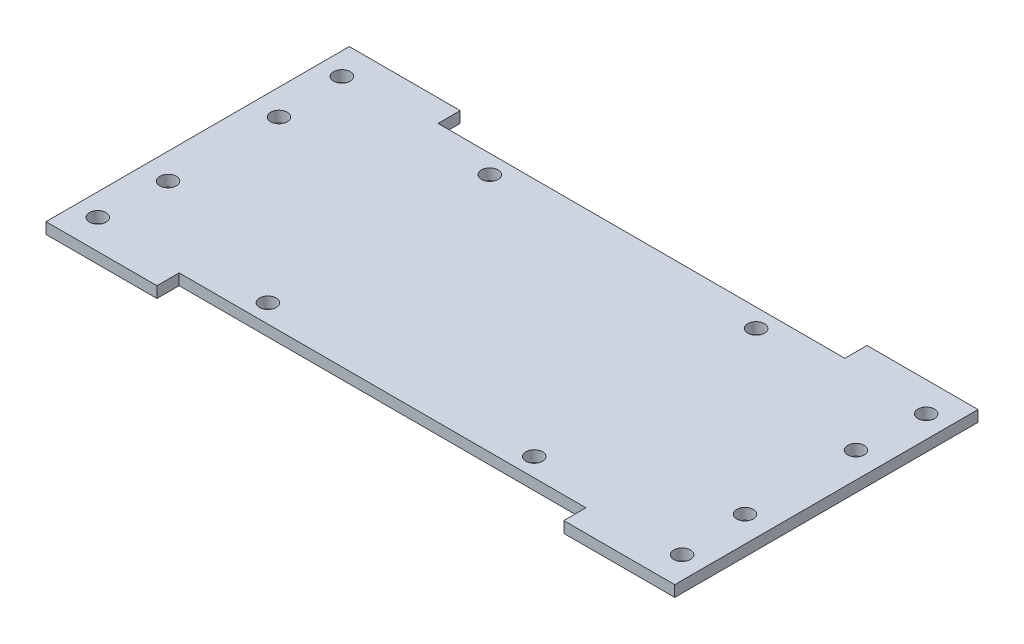
ISO-10303-21;
HEADER;
FILE_DESCRIPTION(('STEP AP214'),'2;1');
FILE_NAME('part.step','',(''),(''),'','','');
FILE_SCHEMA(('AUTOMOTIVE_DESIGN { 1 0 10303 214 1 1 1 1 }'));
ENDSEC;
DATA;
#1=APPLICATION_CONTEXT('core data for automotive mechanical design processes');
#2=APPLICATION_PROTOCOL_DEFINITION('international standard','automotive_design',2000,#1);
#3=PRODUCT_CONTEXT('',#1,'mechanical');
#4=PRODUCT('Part','Part','',(#3));
#5=PRODUCT_RELATED_PRODUCT_CATEGORY('part','',(#4));
#6=PRODUCT_DEFINITION_FORMATION('','',#4);
#7=PRODUCT_DEFINITION_CONTEXT('part definition',#1,'design');
#8=PRODUCT_DEFINITION('design','',#6,#7);
#9=PRODUCT_DEFINITION_SHAPE('','',#8);
#10=(LENGTH_UNIT() NAMED_UNIT(*) SI_UNIT(.MILLI.,.METRE.));
#11=(NAMED_UNIT(*) PLANE_ANGLE_UNIT() SI_UNIT($,.RADIAN.));
#12=(NAMED_UNIT(*) SI_UNIT($,.STERADIAN.) SOLID_ANGLE_UNIT());
#13=UNCERTAINTY_MEASURE_WITH_UNIT(LENGTH_MEASURE(1.E-05),#10,'distance_accuracy_value','');
#14=(GEOMETRIC_REPRESENTATION_CONTEXT(3) GLOBAL_UNCERTAINTY_ASSIGNED_CONTEXT((#13)) GLOBAL_UNIT_ASSIGNED_CONTEXT((#10,
#11,#12)) REPRESENTATION_CONTEXT('',''));
#15=CARTESIAN_POINT('',(0.,0.,0.));
#16=DIRECTION('',(0.,0.,1.));
#17=DIRECTION('',(1.,0.,0.));
#18=AXIS2_PLACEMENT_3D('',#15,#16,#17);
#19=CARTESIAN_POINT('',(0.,1.5,17.5));
#20=DIRECTION('',(0.,0.,1.));
#21=DIRECTION('',(1.,0.,0.));
#22=AXIS2_PLACEMENT_3D('',#19,#20,#21);
#23=PLANE('',#22);
#24=DIRECTION('',(-1.,0.,0.));
#25=VECTOR('',#24,1.);
#26=CARTESIAN_POINT('',(0.,0.,17.5));
#27=LINE('',#26,#25);
#28=CARTESIAN_POINT('',(27.5,0.,17.5));
#29=VERTEX_POINT('',#28);
#30=CARTESIAN_POINT('',(-27.5,0.,17.5));
#31=VERTEX_POINT('',#30);
#32=EDGE_CURVE('E75',#29,#31,#27,.T.);
#33=ORIENTED_EDGE('',*,*,#32,.F.);
#34=DIRECTION('',(0.,-1.,0.));
#35=VECTOR('',#34,1.);
#36=CARTESIAN_POINT('',(27.5,1.5,17.5));
#37=LINE('',#36,#35);
#38=CARTESIAN_POINT('',(27.5,1.5,17.5));
#39=VERTEX_POINT('',#38);
#40=EDGE_CURVE('E50',#39,#29,#37,.T.);
#41=ORIENTED_EDGE('',*,*,#40,.F.);
#42=DIRECTION('',(-1.,0.,0.));
#43=VECTOR('',#42,1.);
#44=CARTESIAN_POINT('',(0.,1.5,17.5));
#45=LINE('',#44,#43);
#46=CARTESIAN_POINT('',(-27.5,1.5,17.5));
#47=VERTEX_POINT('',#46);
#48=EDGE_CURVE('E83',#39,#47,#45,.T.);
#49=ORIENTED_EDGE('',*,*,#48,.T.);
#50=DIRECTION('',(0.,-1.,0.));
#51=VECTOR('',#50,1.);
#52=CARTESIAN_POINT('',(-27.5,1.5,17.5));
#53=LINE('',#52,#51);
#54=EDGE_CURVE('E11',#47,#31,#53,.T.);
#55=ORIENTED_EDGE('',*,*,#54,.T.);
#56=EDGE_LOOP('',(#33,#41,#49,#55));
#57=FACE_BOUND('',#56,.T.);
#58=ADVANCED_FACE('F41',(#57),#23,.T.);
#59=CARTESIAN_POINT('',(0.,1.5,-17.5));
#60=DIRECTION('',(0.,0.,1.));
#61=DIRECTION('',(1.,0.,0.));
#62=AXIS2_PLACEMENT_3D('',#59,#60,#61);
#63=PLANE('',#62);
#64=DIRECTION('',(-1.,0.,0.));
#65=VECTOR('',#64,1.);
#66=CARTESIAN_POINT('',(0.,0.,-17.5));
#67=LINE('',#66,#65);
#68=CARTESIAN_POINT('',(27.5,0.,-17.5));
#69=VERTEX_POINT('',#68);
#70=CARTESIAN_POINT('',(-27.5,0.,-17.5));
#71=VERTEX_POINT('',#70);
#72=EDGE_CURVE('E101',#69,#71,#67,.T.);
#73=ORIENTED_EDGE('',*,*,#72,.T.);
#74=DIRECTION('',(0.,-1.,0.));
#75=VECTOR('',#74,1.);
#76=CARTESIAN_POINT('',(-27.5,1.5,-17.5));
#77=LINE('',#76,#75);
#78=CARTESIAN_POINT('',(-27.5,1.5,-17.5));
#79=VERTEX_POINT('',#78);
#80=EDGE_CURVE('E146',#79,#71,#77,.T.);
#81=ORIENTED_EDGE('',*,*,#80,.F.);
#82=DIRECTION('',(-1.,0.,0.));
#83=VECTOR('',#82,1.);
#84=CARTESIAN_POINT('',(0.,1.5,-17.5));
#85=LINE('',#84,#83);
#86=CARTESIAN_POINT('',(27.5,1.5,-17.5));
#87=VERTEX_POINT('',#86);
#88=EDGE_CURVE('E58',#87,#79,#85,.T.);
#89=ORIENTED_EDGE('',*,*,#88,.F.);
#90=DIRECTION('',(0.,-1.,0.));
#91=VECTOR('',#90,1.);
#92=CARTESIAN_POINT('',(27.5,1.5,-17.5));
#93=LINE('',#92,#91);
#94=EDGE_CURVE('E89',#87,#69,#93,.T.);
#95=ORIENTED_EDGE('',*,*,#94,.T.);
#96=EDGE_LOOP('',(#73,#81,#89,#95));
#97=FACE_BOUND('',#96,.T.);
#98=ADVANCED_FACE('F159',(#97),#63,.F.);
#99=CARTESIAN_POINT('',(0.,1.5,0.));
#100=DIRECTION('',(0.,1.,0.));
#101=DIRECTION('',(0.,0.,1.));
#102=AXIS2_PLACEMENT_3D('',#99,#100,#101);
#103=PLANE('',#102);
#104=CARTESIAN_POINT('',(39.,1.5,7.5));
#105=DIRECTION('',(0.,1.,0.));
#106=DIRECTION('',(0.,0.,1.));
#107=AXIS2_PLACEMENT_3D('',#104,#105,#106);
#108=CIRCLE('',#107,1.125);
#109=CARTESIAN_POINT('',(39.,1.5,8.625));
#110=VERTEX_POINT('',#109);
#111=EDGE_CURVE('E310',#110,#110,#108,.T.);
#112=ORIENTED_EDGE('',*,*,#111,.F.);
#113=EDGE_LOOP('',(#112));
#114=FACE_BOUND('',#113,.T.);
#115=CARTESIAN_POINT('',(39.,1.5,-7.5));
#116=DIRECTION('',(0.,1.,0.));
#117=DIRECTION('',(0.,0.,1.));
#118=AXIS2_PLACEMENT_3D('',#115,#116,#117);
#119=CIRCLE('',#118,1.125);
#120=CARTESIAN_POINT('',(39.,1.5,-6.375));
#121=VERTEX_POINT('',#120);
#122=EDGE_CURVE('E314',#121,#121,#119,.T.);
#123=ORIENTED_EDGE('',*,*,#122,.F.);
#124=EDGE_LOOP('',(#123));
#125=FACE_BOUND('',#124,.T.);
#126=CARTESIAN_POINT('',(39.5,1.5,-16.5));
#127=DIRECTION('',(0.,1.,0.));
#128=DIRECTION('',(0.,0.,1.));
#129=AXIS2_PLACEMENT_3D('',#126,#127,#128);
#130=CIRCLE('',#129,1.125);
#131=CARTESIAN_POINT('',(39.5,1.5,-15.375));
#132=VERTEX_POINT('',#131);
#133=EDGE_CURVE('E318',#132,#132,#130,.T.);
#134=ORIENTED_EDGE('',*,*,#133,.F.);
#135=EDGE_LOOP('',(#134));
#136=FACE_BOUND('',#135,.T.);
#137=CARTESIAN_POINT('',(39.5,1.5,16.5));
#138=DIRECTION('',(0.,1.,0.));
#139=DIRECTION('',(0.,0.,1.));
#140=AXIS2_PLACEMENT_3D('',#137,#138,#139);
#141=CIRCLE('',#140,1.125);
#142=CARTESIAN_POINT('',(39.5,1.5,17.625));
#143=VERTEX_POINT('',#142);
#144=EDGE_CURVE('E322',#143,#143,#141,.T.);
#145=ORIENTED_EDGE('',*,*,#144,.F.);
#146=EDGE_LOOP('',(#145));
#147=FACE_BOUND('',#146,.T.);
#148=CARTESIAN_POINT('',(-39.,1.5,7.5));
#149=DIRECTION('',(0.,1.,0.));
#150=DIRECTION('',(0.,0.,1.));
#151=AXIS2_PLACEMENT_3D('',#148,#149,#150);
#152=CIRCLE('',#151,1.125);
#153=CARTESIAN_POINT('',(-39.,1.5,8.625));
#154=VERTEX_POINT('',#153);
#155=EDGE_CURVE('E247',#154,#154,#152,.F.);
#156=ORIENTED_EDGE('',*,*,#155,.T.);
#157=EDGE_LOOP('',(#156));
#158=FACE_BOUND('',#157,.T.);
#159=CARTESIAN_POINT('',(-39.,1.5,-7.5));
#160=DIRECTION('',(0.,1.,0.));
#161=DIRECTION('',(0.,0.,1.));
#162=AXIS2_PLACEMENT_3D('',#159,#160,#161);
#163=CIRCLE('',#162,1.125);
#164=CARTESIAN_POINT('',(-39.,1.5,-6.375));
#165=VERTEX_POINT('',#164);
#166=EDGE_CURVE('E250',#165,#165,#163,.F.);
#167=ORIENTED_EDGE('',*,*,#166,.T.);
#168=EDGE_LOOP('',(#167));
#169=FACE_BOUND('',#168,.T.);
#170=CARTESIAN_POINT('',(-39.5,1.5,-16.5));
#171=DIRECTION('',(0.,1.,0.));
#172=DIRECTION('',(0.,0.,1.));
#173=AXIS2_PLACEMENT_3D('',#170,#171,#172);
#174=CIRCLE('',#173,1.125);
#175=CARTESIAN_POINT('',(-39.5,1.5,-15.375));
#176=VERTEX_POINT('',#175);
#177=EDGE_CURVE('E254',#176,#176,#174,.F.);
#178=ORIENTED_EDGE('',*,*,#177,.T.);
#179=EDGE_LOOP('',(#178));
#180=FACE_BOUND('',#179,.T.);
#181=CARTESIAN_POINT('',(-18.,1.5,-15.));
#182=DIRECTION('',(0.,1.,0.));
#183=DIRECTION('',(0.,0.,1.));
#184=AXIS2_PLACEMENT_3D('',#181,#182,#183);
#185=CIRCLE('',#184,1.125);
#186=CARTESIAN_POINT('',(-18.,1.5,-13.875));
#187=VERTEX_POINT('',#186);
#188=EDGE_CURVE('E258',#187,#187,#185,.F.);
#189=ORIENTED_EDGE('',*,*,#188,.T.);
#190=EDGE_LOOP('',(#189));
#191=FACE_BOUND('',#190,.T.);
#192=CARTESIAN_POINT('',(18.,1.5,15.));
#193=DIRECTION('',(0.,1.,0.));
#194=DIRECTION('',(0.,0.,1.));
#195=AXIS2_PLACEMENT_3D('',#192,#193,#194);
#196=CIRCLE('',#195,1.125);
#197=CARTESIAN_POINT('',(18.,1.5,16.125));
#198=VERTEX_POINT('',#197);
#199=EDGE_CURVE('E262',#198,#198,#196,.F.);
#200=ORIENTED_EDGE('',*,*,#199,.T.);
#201=EDGE_LOOP('',(#200));
#202=FACE_BOUND('',#201,.T.);
#203=CARTESIAN_POINT('',(-18.,1.5,15.));
#204=DIRECTION('',(0.,1.,0.));
#205=DIRECTION('',(0.,0.,1.));
#206=AXIS2_PLACEMENT_3D('',#203,#204,#205);
#207=CIRCLE('',#206,1.125);
#208=CARTESIAN_POINT('',(-18.,1.5,16.125));
#209=VERTEX_POINT('',#208);
#210=EDGE_CURVE('E266',#209,#209,#207,.F.);
#211=ORIENTED_EDGE('',*,*,#210,.T.);
#212=EDGE_LOOP('',(#211));
#213=FACE_BOUND('',#212,.T.);
#214=CARTESIAN_POINT('',(18.,1.5,-15.));
#215=DIRECTION('',(0.,1.,0.));
#216=DIRECTION('',(0.,0.,1.));
#217=AXIS2_PLACEMENT_3D('',#214,#215,#216);
#218=CIRCLE('',#217,1.125);
#219=CARTESIAN_POINT('',(18.,1.5,-13.875));
#220=VERTEX_POINT('',#219);
#221=EDGE_CURVE('E270',#220,#220,#218,.F.);
#222=ORIENTED_EDGE('',*,*,#221,.T.);
#223=EDGE_LOOP('',(#222));
#224=FACE_BOUND('',#223,.T.);
#225=CARTESIAN_POINT('',(-39.5,1.5,16.5));
#226=DIRECTION('',(0.,1.,0.));
#227=DIRECTION('',(0.,0.,1.));
#228=AXIS2_PLACEMENT_3D('',#225,#226,#227);
#229=CIRCLE('',#228,1.125);
#230=CARTESIAN_POINT('',(-39.5,1.5,17.625));
#231=VERTEX_POINT('',#230);
#232=EDGE_CURVE('E274',#231,#231,#229,.F.);
#233=ORIENTED_EDGE('',*,*,#232,.T.);
#234=EDGE_LOOP('',(#233));
#235=FACE_BOUND('',#234,.T.);
#236=ORIENTED_EDGE('',*,*,#88,.T.);
#237=DIRECTION('',(0.,0.,-1.));
#238=VECTOR('',#237,1.);
#239=CARTESIAN_POINT('',(-27.5,1.5,20.5));
#240=LINE('',#239,#238);
#241=CARTESIAN_POINT('',(-27.5,1.5,-20.5));
#242=VERTEX_POINT('',#241);
#243=EDGE_CURVE('E201',#79,#242,#240,.T.);
#244=ORIENTED_EDGE('',*,*,#243,.T.);
#245=DIRECTION('',(-1.,0.,0.));
#246=VECTOR('',#245,1.);
#247=CARTESIAN_POINT('',(-42.5,1.5,-20.5));
#248=LINE('',#247,#246);
#249=CARTESIAN_POINT('',(-42.5,1.5,-20.5));
#250=VERTEX_POINT('',#249);
#251=EDGE_CURVE('E210',#242,#250,#248,.T.);
#252=ORIENTED_EDGE('',*,*,#251,.T.);
#253=DIRECTION('',(0.,0.,1.));
#254=VECTOR('',#253,1.);
#255=CARTESIAN_POINT('',(-42.5,1.5,20.5));
#256=LINE('',#255,#254);
#257=CARTESIAN_POINT('',(-42.5,1.5,20.5));
#258=VERTEX_POINT('',#257);
#259=EDGE_CURVE('E206',#250,#258,#256,.T.);
#260=ORIENTED_EDGE('',*,*,#259,.T.);
#261=DIRECTION('',(1.,0.,0.));
#262=VECTOR('',#261,1.);
#263=CARTESIAN_POINT('',(-42.5,1.5,20.5));
#264=LINE('',#263,#262);
#265=CARTESIAN_POINT('',(-27.5,1.5,20.5));
#266=VERTEX_POINT('',#265);
#267=EDGE_CURVE('E204',#258,#266,#264,.T.);
#268=ORIENTED_EDGE('',*,*,#267,.T.);
#269=EDGE_CURVE('E99',#266,#47,#240,.T.);
#270=ORIENTED_EDGE('',*,*,#269,.T.);
#271=ORIENTED_EDGE('',*,*,#48,.F.);
#272=DIRECTION('',(0.,0.,1.));
#273=VECTOR('',#272,1.);
#274=CARTESIAN_POINT('',(27.5,1.5,20.5));
#275=LINE('',#274,#273);
#276=CARTESIAN_POINT('',(27.5,1.5,20.5));
#277=VERTEX_POINT('',#276);
#278=EDGE_CURVE('E95',#39,#277,#275,.T.);
#279=ORIENTED_EDGE('',*,*,#278,.T.);
#280=DIRECTION('',(1.,0.,0.));
#281=VECTOR('',#280,1.);
#282=CARTESIAN_POINT('',(42.5,1.5,20.5));
#283=LINE('',#282,#281);
#284=CARTESIAN_POINT('',(42.5,1.5,20.5));
#285=VERTEX_POINT('',#284);
#286=EDGE_CURVE('E123',#277,#285,#283,.T.);
#287=ORIENTED_EDGE('',*,*,#286,.T.);
#288=DIRECTION('',(0.,0.,-1.));
#289=VECTOR('',#288,1.);
#290=CARTESIAN_POINT('',(42.5,1.5,20.5));
#291=LINE('',#290,#289);
#292=CARTESIAN_POINT('',(42.5,1.5,-20.5));
#293=VERTEX_POINT('',#292);
#294=EDGE_CURVE('E114',#285,#293,#291,.T.);
#295=ORIENTED_EDGE('',*,*,#294,.T.);
#296=DIRECTION('',(-1.,0.,0.));
#297=VECTOR('',#296,1.);
#298=CARTESIAN_POINT('',(42.5,1.5,-20.5));
#299=LINE('',#298,#297);
#300=CARTESIAN_POINT('',(27.5,1.5,-20.5));
#301=VERTEX_POINT('',#300);
#302=EDGE_CURVE('E109',#293,#301,#299,.T.);
#303=ORIENTED_EDGE('',*,*,#302,.T.);
#304=EDGE_CURVE('E108',#301,#87,#275,.T.);
#305=ORIENTED_EDGE('',*,*,#304,.T.);
#306=EDGE_LOOP('',(#236,#244,#252,#260,#268,#270,#271,#279,#287,#295,#303,#305));
#307=FACE_BOUND('',#306,.T.);
#308=ADVANCED_FACE('F92',(#114,#125,#136,#147,#158,#169,#180,#191,#202,#213,#224,#235,#307),
#103,.T.);
#309=CARTESIAN_POINT('',(0.,0.,0.));
#310=DIRECTION('',(0.,1.,0.));
#311=DIRECTION('',(0.,0.,1.));
#312=AXIS2_PLACEMENT_3D('',#309,#310,#311);
#313=PLANE('',#312);
#314=CARTESIAN_POINT('',(39.,0.,7.5));
#315=DIRECTION('',(0.,-1.,0.));
#316=DIRECTION('',(0.,0.,1.));
#317=AXIS2_PLACEMENT_3D('',#314,#315,#316);
#318=CIRCLE('',#317,1.125);
#319=CARTESIAN_POINT('',(39.,0.,8.625));
#320=VERTEX_POINT('',#319);
#321=EDGE_CURVE('E330',#320,#320,#318,.T.);
#322=ORIENTED_EDGE('',*,*,#321,.F.);
#323=EDGE_LOOP('',(#322));
#324=FACE_BOUND('',#323,.T.);
#325=CARTESIAN_POINT('',(39.,0.,-7.5));
#326=DIRECTION('',(0.,-1.,0.));
#327=DIRECTION('',(0.,0.,1.));
#328=AXIS2_PLACEMENT_3D('',#325,#326,#327);
#329=CIRCLE('',#328,1.125);
#330=CARTESIAN_POINT('',(39.,0.,-6.375));
#331=VERTEX_POINT('',#330);
#332=EDGE_CURVE('E334',#331,#331,#329,.T.);
#333=ORIENTED_EDGE('',*,*,#332,.F.);
#334=EDGE_LOOP('',(#333));
#335=FACE_BOUND('',#334,.T.);
#336=CARTESIAN_POINT('',(39.5,0.,-16.5));
#337=DIRECTION('',(0.,-1.,0.));
#338=DIRECTION('',(0.,0.,1.));
#339=AXIS2_PLACEMENT_3D('',#336,#337,#338);
#340=CIRCLE('',#339,1.125);
#341=CARTESIAN_POINT('',(39.5,0.,-15.375));
#342=VERTEX_POINT('',#341);
#343=EDGE_CURVE('E338',#342,#342,#340,.T.);
#344=ORIENTED_EDGE('',*,*,#343,.F.);
#345=EDGE_LOOP('',(#344));
#346=FACE_BOUND('',#345,.T.);
#347=CARTESIAN_POINT('',(39.5,0.,16.5));
#348=DIRECTION('',(0.,-1.,0.));
#349=DIRECTION('',(0.,0.,1.));
#350=AXIS2_PLACEMENT_3D('',#347,#348,#349);
#351=CIRCLE('',#350,1.125);
#352=CARTESIAN_POINT('',(39.5,0.,17.625));
#353=VERTEX_POINT('',#352);
#354=EDGE_CURVE('E326',#353,#353,#351,.T.);
#355=ORIENTED_EDGE('',*,*,#354,.F.);
#356=EDGE_LOOP('',(#355));
#357=FACE_BOUND('',#356,.T.);
#358=CARTESIAN_POINT('',(-39.,0.,7.5));
#359=DIRECTION('',(0.,1.,0.));
#360=DIRECTION('',(0.,0.,1.));
#361=AXIS2_PLACEMENT_3D('',#358,#359,#360);
#362=CIRCLE('',#361,1.125);
#363=CARTESIAN_POINT('',(-39.,0.,8.625));
#364=VERTEX_POINT('',#363);
#365=EDGE_CURVE('E282',#364,#364,#362,.T.);
#366=ORIENTED_EDGE('',*,*,#365,.T.);
#367=EDGE_LOOP('',(#366));
#368=FACE_BOUND('',#367,.T.);
#369=CARTESIAN_POINT('',(-39.,0.,-7.5));
#370=DIRECTION('',(0.,1.,0.));
#371=DIRECTION('',(0.,0.,1.));
#372=AXIS2_PLACEMENT_3D('',#369,#370,#371);
#373=CIRCLE('',#372,1.125);
#374=CARTESIAN_POINT('',(-39.,0.,-6.375));
#375=VERTEX_POINT('',#374);
#376=EDGE_CURVE('E286',#375,#375,#373,.T.);
#377=ORIENTED_EDGE('',*,*,#376,.T.);
#378=EDGE_LOOP('',(#377));
#379=FACE_BOUND('',#378,.T.);
#380=CARTESIAN_POINT('',(-39.5,0.,-16.5));
#381=DIRECTION('',(0.,1.,0.));
#382=DIRECTION('',(0.,0.,1.));
#383=AXIS2_PLACEMENT_3D('',#380,#381,#382);
#384=CIRCLE('',#383,1.125);
#385=CARTESIAN_POINT('',(-39.5,0.,-15.375));
#386=VERTEX_POINT('',#385);
#387=EDGE_CURVE('E290',#386,#386,#384,.T.);
#388=ORIENTED_EDGE('',*,*,#387,.T.);
#389=EDGE_LOOP('',(#388));
#390=FACE_BOUND('',#389,.T.);
#391=CARTESIAN_POINT('',(-18.,0.,-15.));
#392=DIRECTION('',(0.,1.,0.));
#393=DIRECTION('',(0.,0.,1.));
#394=AXIS2_PLACEMENT_3D('',#391,#392,#393);
#395=CIRCLE('',#394,1.125);
#396=CARTESIAN_POINT('',(-18.,0.,-13.875));
#397=VERTEX_POINT('',#396);
#398=EDGE_CURVE('E294',#397,#397,#395,.T.);
#399=ORIENTED_EDGE('',*,*,#398,.T.);
#400=EDGE_LOOP('',(#399));
#401=FACE_BOUND('',#400,.T.);
#402=CARTESIAN_POINT('',(18.,0.,15.));
#403=DIRECTION('',(0.,1.,0.));
#404=DIRECTION('',(0.,0.,1.));
#405=AXIS2_PLACEMENT_3D('',#402,#403,#404);
#406=CIRCLE('',#405,1.125);
#407=CARTESIAN_POINT('',(18.,0.,16.125));
#408=VERTEX_POINT('',#407);
#409=EDGE_CURVE('E306',#408,#408,#406,.T.);
#410=ORIENTED_EDGE('',*,*,#409,.T.);
#411=EDGE_LOOP('',(#410));
#412=FACE_BOUND('',#411,.T.);
#413=CARTESIAN_POINT('',(-18.,0.,15.));
#414=DIRECTION('',(0.,1.,0.));
#415=DIRECTION('',(0.,0.,1.));
#416=AXIS2_PLACEMENT_3D('',#413,#414,#415);
#417=CIRCLE('',#416,1.125);
#418=CARTESIAN_POINT('',(-18.,0.,16.125));
#419=VERTEX_POINT('',#418);
#420=EDGE_CURVE('E302',#419,#419,#417,.T.);
#421=ORIENTED_EDGE('',*,*,#420,.T.);
#422=EDGE_LOOP('',(#421));
#423=FACE_BOUND('',#422,.T.);
#424=CARTESIAN_POINT('',(18.,0.,-15.));
#425=DIRECTION('',(0.,1.,0.));
#426=DIRECTION('',(0.,0.,1.));
#427=AXIS2_PLACEMENT_3D('',#424,#425,#426);
#428=CIRCLE('',#427,1.125);
#429=CARTESIAN_POINT('',(18.,0.,-13.875));
#430=VERTEX_POINT('',#429);
#431=EDGE_CURVE('E298',#430,#430,#428,.T.);
#432=ORIENTED_EDGE('',*,*,#431,.T.);
#433=EDGE_LOOP('',(#432));
#434=FACE_BOUND('',#433,.T.);
#435=CARTESIAN_POINT('',(-39.5,0.,16.5));
#436=DIRECTION('',(0.,1.,0.));
#437=DIRECTION('',(0.,0.,1.));
#438=AXIS2_PLACEMENT_3D('',#435,#436,#437);
#439=CIRCLE('',#438,1.125);
#440=CARTESIAN_POINT('',(-39.5,0.,17.625));
#441=VERTEX_POINT('',#440);
#442=EDGE_CURVE('E278',#441,#441,#439,.T.);
#443=ORIENTED_EDGE('',*,*,#442,.T.);
#444=EDGE_LOOP('',(#443));
#445=FACE_BOUND('',#444,.T.);
#446=ORIENTED_EDGE('',*,*,#32,.T.);
#447=DIRECTION('',(0.,0.,-1.));
#448=VECTOR('',#447,1.);
#449=CARTESIAN_POINT('',(-27.5,0.,20.5));
#450=LINE('',#449,#448);
#451=CARTESIAN_POINT('',(-27.5,0.,20.5));
#452=VERTEX_POINT('',#451);
#453=EDGE_CURVE('E222',#452,#31,#450,.T.);
#454=ORIENTED_EDGE('',*,*,#453,.F.);
#455=DIRECTION('',(1.,0.,0.));
#456=VECTOR('',#455,1.);
#457=CARTESIAN_POINT('',(-42.5,0.,20.5));
#458=LINE('',#457,#456);
#459=CARTESIAN_POINT('',(-42.5,0.,20.5));
#460=VERTEX_POINT('',#459);
#461=EDGE_CURVE('E231',#460,#452,#458,.T.);
#462=ORIENTED_EDGE('',*,*,#461,.F.);
#463=DIRECTION('',(0.,0.,1.));
#464=VECTOR('',#463,1.);
#465=CARTESIAN_POINT('',(-42.5,0.,20.5));
#466=LINE('',#465,#464);
#467=CARTESIAN_POINT('',(-42.5,0.,-20.5));
#468=VERTEX_POINT('',#467);
#469=EDGE_CURVE('E239',#468,#460,#466,.T.);
#470=ORIENTED_EDGE('',*,*,#469,.F.);
#471=DIRECTION('',(-1.,0.,0.));
#472=VECTOR('',#471,1.);
#473=CARTESIAN_POINT('',(-42.5,0.,-20.5));
#474=LINE('',#473,#472);
#475=CARTESIAN_POINT('',(-27.5,0.,-20.5));
#476=VERTEX_POINT('',#475);
#477=EDGE_CURVE('E214',#476,#468,#474,.T.);
#478=ORIENTED_EDGE('',*,*,#477,.F.);
#479=EDGE_CURVE('E172',#71,#476,#450,.T.);
#480=ORIENTED_EDGE('',*,*,#479,.F.);
#481=ORIENTED_EDGE('',*,*,#72,.F.);
#482=DIRECTION('',(0.,0.,1.));
#483=VECTOR('',#482,1.);
#484=CARTESIAN_POINT('',(27.5,0.,20.5));
#485=LINE('',#484,#483);
#486=CARTESIAN_POINT('',(27.5,0.,-20.5));
#487=VERTEX_POINT('',#486);
#488=EDGE_CURVE('E139',#487,#69,#485,.T.);
#489=ORIENTED_EDGE('',*,*,#488,.F.);
#490=DIRECTION('',(-1.,0.,0.));
#491=VECTOR('',#490,1.);
#492=CARTESIAN_POINT('',(42.5,0.,-20.5));
#493=LINE('',#492,#491);
#494=CARTESIAN_POINT('',(42.5,0.,-20.5));
#495=VERTEX_POINT('',#494);
#496=EDGE_CURVE('E131',#495,#487,#493,.T.);
#497=ORIENTED_EDGE('',*,*,#496,.F.);
#498=DIRECTION('',(0.,0.,-1.));
#499=VECTOR('',#498,1.);
#500=CARTESIAN_POINT('',(42.5,0.,20.5));
#501=LINE('',#500,#499);
#502=CARTESIAN_POINT('',(42.5,0.,20.5));
#503=VERTEX_POINT('',#502);
#504=EDGE_CURVE('E117',#503,#495,#501,.T.);
#505=ORIENTED_EDGE('',*,*,#504,.F.);
#506=DIRECTION('',(1.,0.,0.));
#507=VECTOR('',#506,1.);
#508=CARTESIAN_POINT('',(42.5,0.,20.5));
#509=LINE('',#508,#507);
#510=CARTESIAN_POINT('',(27.5,0.,20.5));
#511=VERTEX_POINT('',#510);
#512=EDGE_CURVE('E126',#511,#503,#509,.T.);
#513=ORIENTED_EDGE('',*,*,#512,.F.);
#514=EDGE_CURVE('E136',#29,#511,#485,.T.);
#515=ORIENTED_EDGE('',*,*,#514,.F.);
#516=EDGE_LOOP('',(#446,#454,#462,#470,#478,#480,#481,#489,#497,#505,#513,#515));
#517=FACE_BOUND('',#516,.T.);
#518=ADVANCED_FACE('F167',(#324,#335,#346,#357,#368,#379,#390,#401,#412,#423,#434,#445,#517),
#313,.F.);
#519=CARTESIAN_POINT('',(27.5,45.1577599058862,20.5));
#520=DIRECTION('',(1.,0.,0.));
#521=DIRECTION('',(0.,0.,-1.));
#522=AXIS2_PLACEMENT_3D('',#519,#520,#521);
#523=PLANE('',#522);
#524=ORIENTED_EDGE('',*,*,#278,.F.);
#525=ORIENTED_EDGE('',*,*,#40,.T.);
#526=ORIENTED_EDGE('',*,*,#514,.T.);
#527=DIRECTION('',(0.,-1.,0.));
#528=VECTOR('',#527,1.);
#529=CARTESIAN_POINT('',(27.5,45.1577599058862,20.5));
#530=LINE('',#529,#528);
#531=EDGE_CURVE('E105',#277,#511,#530,.T.);
#532=ORIENTED_EDGE('',*,*,#531,.F.);
#533=EDGE_LOOP('',(#524,#525,#526,#532));
#534=FACE_BOUND('',#533,.T.);
#535=ADVANCED_FACE('F103',(#534),#523,.F.);
#536=CARTESIAN_POINT('',(42.5,45.1577599058862,20.5));
#537=DIRECTION('',(-1.,0.,0.));
#538=DIRECTION('',(0.,0.,1.));
#539=AXIS2_PLACEMENT_3D('',#536,#537,#538);
#540=PLANE('',#539);
#541=ORIENTED_EDGE('',*,*,#294,.F.);
#542=DIRECTION('',(0.,-1.,0.));
#543=VECTOR('',#542,1.);
#544=CARTESIAN_POINT('',(42.5,45.1577599058862,20.5));
#545=LINE('',#544,#543);
#546=EDGE_CURVE('E140',#285,#503,#545,.T.);
#547=ORIENTED_EDGE('',*,*,#546,.T.);
#548=ORIENTED_EDGE('',*,*,#504,.T.);
#549=DIRECTION('',(0.,-1.,0.));
#550=VECTOR('',#549,1.);
#551=CARTESIAN_POINT('',(42.5,45.1577599058862,-20.5));
#552=LINE('',#551,#550);
#553=EDGE_CURVE('E127',#293,#495,#552,.T.);
#554=ORIENTED_EDGE('',*,*,#553,.F.);
#555=EDGE_LOOP('',(#541,#547,#548,#554));
#556=FACE_BOUND('',#555,.T.);
#557=ADVANCED_FACE('F196',(#556),#540,.F.);
#558=CARTESIAN_POINT('',(42.5,45.1577599058862,-20.5));
#559=DIRECTION('',(0.,0.,1.));
#560=DIRECTION('',(1.,0.,0.));
#561=AXIS2_PLACEMENT_3D('',#558,#559,#560);
#562=PLANE('',#561);
#563=ORIENTED_EDGE('',*,*,#302,.F.);
#564=ORIENTED_EDGE('',*,*,#553,.T.);
#565=ORIENTED_EDGE('',*,*,#496,.T.);
#566=DIRECTION('',(0.,-1.,0.));
#567=VECTOR('',#566,1.);
#568=CARTESIAN_POINT('',(27.5,45.1577599058862,-20.5));
#569=LINE('',#568,#567);
#570=EDGE_CURVE('E132',#301,#487,#569,.T.);
#571=ORIENTED_EDGE('',*,*,#570,.F.);
#572=EDGE_LOOP('',(#563,#564,#565,#571));
#573=FACE_BOUND('',#572,.T.);
#574=ADVANCED_FACE('F184',(#573),#562,.F.);
#575=ORIENTED_EDGE('',*,*,#94,.F.);
#576=ORIENTED_EDGE('',*,*,#304,.F.);
#577=ORIENTED_EDGE('',*,*,#570,.T.);
#578=ORIENTED_EDGE('',*,*,#488,.T.);
#579=EDGE_LOOP('',(#575,#576,#577,#578));
#580=FACE_BOUND('',#579,.T.);
#581=ADVANCED_FACE('F173',(#580),#523,.F.);
#582=CARTESIAN_POINT('',(42.5,45.1577599058862,20.5));
#583=DIRECTION('',(0.,0.,-1.));
#584=DIRECTION('',(-1.,0.,0.));
#585=AXIS2_PLACEMENT_3D('',#582,#583,#584);
#586=PLANE('',#585);
#587=ORIENTED_EDGE('',*,*,#286,.F.);
#588=ORIENTED_EDGE('',*,*,#531,.T.);
#589=ORIENTED_EDGE('',*,*,#512,.T.);
#590=ORIENTED_EDGE('',*,*,#546,.F.);
#591=EDGE_LOOP('',(#587,#588,#589,#590));
#592=FACE_BOUND('',#591,.T.);
#593=ADVANCED_FACE('F402',(#592),#586,.F.);
#594=CARTESIAN_POINT('',(-27.5,45.1577599058862,20.5));
#595=DIRECTION('',(-1.,0.,0.));
#596=DIRECTION('',(0.,0.,1.));
#597=AXIS2_PLACEMENT_3D('',#594,#595,#596);
#598=PLANE('',#597);
#599=ORIENTED_EDGE('',*,*,#243,.F.);
#600=ORIENTED_EDGE('',*,*,#80,.T.);
#601=ORIENTED_EDGE('',*,*,#479,.T.);
#602=DIRECTION('',(0.,-1.,0.));
#603=VECTOR('',#602,1.);
#604=CARTESIAN_POINT('',(-27.5,45.1577599058862,-20.5));
#605=LINE('',#604,#603);
#606=EDGE_CURVE('E218',#242,#476,#605,.T.);
#607=ORIENTED_EDGE('',*,*,#606,.F.);
#608=EDGE_LOOP('',(#599,#600,#601,#607));
#609=FACE_BOUND('',#608,.T.);
#610=ADVANCED_FACE('F405',(#609),#598,.F.);
#611=CARTESIAN_POINT('',(-42.5,45.1577599058862,20.5));
#612=DIRECTION('',(1.,0.,0.));
#613=DIRECTION('',(0.,0.,-1.));
#614=AXIS2_PLACEMENT_3D('',#611,#612,#613);
#615=PLANE('',#614);
#616=ORIENTED_EDGE('',*,*,#259,.F.);
#617=DIRECTION('',(0.,-1.,0.));
#618=VECTOR('',#617,1.);
#619=CARTESIAN_POINT('',(-42.5,45.1577599058862,-20.5));
#620=LINE('',#619,#618);
#621=EDGE_CURVE('E243',#250,#468,#620,.T.);
#622=ORIENTED_EDGE('',*,*,#621,.T.);
#623=ORIENTED_EDGE('',*,*,#469,.T.);
#624=DIRECTION('',(0.,-1.,0.));
#625=VECTOR('',#624,1.);
#626=CARTESIAN_POINT('',(-42.5,45.1577599058862,20.5));
#627=LINE('',#626,#625);
#628=EDGE_CURVE('E235',#258,#460,#627,.T.);
#629=ORIENTED_EDGE('',*,*,#628,.F.);
#630=EDGE_LOOP('',(#616,#622,#623,#629));
#631=FACE_BOUND('',#630,.T.);
#632=ADVANCED_FACE('F407',(#631),#615,.F.);
#633=CARTESIAN_POINT('',(-42.5,45.1577599058862,20.5));
#634=DIRECTION('',(0.,0.,-1.));
#635=DIRECTION('',(-1.,0.,0.));
#636=AXIS2_PLACEMENT_3D('',#633,#634,#635);
#637=PLANE('',#636);
#638=ORIENTED_EDGE('',*,*,#267,.F.);
#639=ORIENTED_EDGE('',*,*,#628,.T.);
#640=ORIENTED_EDGE('',*,*,#461,.T.);
#641=DIRECTION('',(0.,-1.,0.));
#642=VECTOR('',#641,1.);
#643=CARTESIAN_POINT('',(-27.5,45.1577599058862,20.5));
#644=LINE('',#643,#642);
#645=EDGE_CURVE('E228',#266,#452,#644,.T.);
#646=ORIENTED_EDGE('',*,*,#645,.F.);
#647=EDGE_LOOP('',(#638,#639,#640,#646));
#648=FACE_BOUND('',#647,.T.);
#649=ADVANCED_FACE('F410',(#648),#637,.F.);
#650=ORIENTED_EDGE('',*,*,#54,.F.);
#651=ORIENTED_EDGE('',*,*,#269,.F.);
#652=ORIENTED_EDGE('',*,*,#645,.T.);
#653=ORIENTED_EDGE('',*,*,#453,.T.);
#654=EDGE_LOOP('',(#650,#651,#652,#653));
#655=FACE_BOUND('',#654,.T.);
#656=ADVANCED_FACE('F381',(#655),#598,.F.);
#657=CARTESIAN_POINT('',(-42.5,45.1577599058862,-20.5));
#658=DIRECTION('',(0.,0.,1.));
#659=DIRECTION('',(1.,0.,0.));
#660=AXIS2_PLACEMENT_3D('',#657,#658,#659);
#661=PLANE('',#660);
#662=ORIENTED_EDGE('',*,*,#251,.F.);
#663=ORIENTED_EDGE('',*,*,#606,.T.);
#664=ORIENTED_EDGE('',*,*,#477,.T.);
#665=ORIENTED_EDGE('',*,*,#621,.F.);
#666=EDGE_LOOP('',(#662,#663,#664,#665));
#667=FACE_BOUND('',#666,.T.);
#668=ADVANCED_FACE('F371',(#667),#661,.F.);
#669=CARTESIAN_POINT('',(-39.5,10.,16.5));
#670=DIRECTION('',(0.,-1.,0.));
#671=DIRECTION('',(0.,0.,-1.));
#672=AXIS2_PLACEMENT_3D('',#669,#670,#671);
#673=CYLINDRICAL_SURFACE('',#672,1.125);
#674=ORIENTED_EDGE('',*,*,#232,.F.);
#675=EDGE_LOOP('',(#674));
#676=FACE_BOUND('',#675,.T.);
#677=ORIENTED_EDGE('',*,*,#442,.F.);
#678=EDGE_LOOP('',(#677));
#679=FACE_BOUND('',#678,.T.);
#680=ADVANCED_FACE('F368',(#676,#679),#673,.F.);
#681=CARTESIAN_POINT('',(18.,10.,-15.));
#682=DIRECTION('',(0.,-1.,0.));
#683=DIRECTION('',(0.,0.,-1.));
#684=AXIS2_PLACEMENT_3D('',#681,#682,#683);
#685=CYLINDRICAL_SURFACE('',#684,1.125);
#686=ORIENTED_EDGE('',*,*,#221,.F.);
#687=EDGE_LOOP('',(#686));
#688=FACE_BOUND('',#687,.T.);
#689=ORIENTED_EDGE('',*,*,#431,.F.);
#690=EDGE_LOOP('',(#689));
#691=FACE_BOUND('',#690,.T.);
#692=ADVANCED_FACE('F370',(#688,#691),#685,.F.);
#693=CARTESIAN_POINT('',(-18.,10.,15.));
#694=DIRECTION('',(0.,-1.,0.));
#695=DIRECTION('',(0.,0.,-1.));
#696=AXIS2_PLACEMENT_3D('',#693,#694,#695);
#697=CYLINDRICAL_SURFACE('',#696,1.125);
#698=ORIENTED_EDGE('',*,*,#210,.F.);
#699=EDGE_LOOP('',(#698));
#700=FACE_BOUND('',#699,.T.);
#701=ORIENTED_EDGE('',*,*,#420,.F.);
#702=EDGE_LOOP('',(#701));
#703=FACE_BOUND('',#702,.T.);
#704=ADVANCED_FACE('F378',(#700,#703),#697,.F.);
#705=CARTESIAN_POINT('',(18.,10.,15.));
#706=DIRECTION('',(0.,-1.,0.));
#707=DIRECTION('',(0.,0.,-1.));
#708=AXIS2_PLACEMENT_3D('',#705,#706,#707);
#709=CYLINDRICAL_SURFACE('',#708,1.125);
#710=ORIENTED_EDGE('',*,*,#199,.F.);
#711=EDGE_LOOP('',(#710));
#712=FACE_BOUND('',#711,.T.);
#713=ORIENTED_EDGE('',*,*,#409,.F.);
#714=EDGE_LOOP('',(#713));
#715=FACE_BOUND('',#714,.T.);
#716=ADVANCED_FACE('F496',(#712,#715),#709,.F.);
#717=CARTESIAN_POINT('',(-18.,10.,-15.));
#718=DIRECTION('',(0.,-1.,0.));
#719=DIRECTION('',(0.,0.,-1.));
#720=AXIS2_PLACEMENT_3D('',#717,#718,#719);
#721=CYLINDRICAL_SURFACE('',#720,1.125);
#722=ORIENTED_EDGE('',*,*,#188,.F.);
#723=EDGE_LOOP('',(#722));
#724=FACE_BOUND('',#723,.T.);
#725=ORIENTED_EDGE('',*,*,#398,.F.);
#726=EDGE_LOOP('',(#725));
#727=FACE_BOUND('',#726,.T.);
#728=ADVANCED_FACE('F506',(#724,#727),#721,.F.);
#729=CARTESIAN_POINT('',(-39.5,10.,-16.5));
#730=DIRECTION('',(0.,-1.,0.));
#731=DIRECTION('',(0.,0.,-1.));
#732=AXIS2_PLACEMENT_3D('',#729,#730,#731);
#733=CYLINDRICAL_SURFACE('',#732,1.125);
#734=ORIENTED_EDGE('',*,*,#177,.F.);
#735=EDGE_LOOP('',(#734));
#736=FACE_BOUND('',#735,.T.);
#737=ORIENTED_EDGE('',*,*,#387,.F.);
#738=EDGE_LOOP('',(#737));
#739=FACE_BOUND('',#738,.T.);
#740=ADVANCED_FACE('F516',(#736,#739),#733,.F.);
#741=CARTESIAN_POINT('',(-39.,10.,-7.5));
#742=DIRECTION('',(0.,-1.,0.));
#743=DIRECTION('',(0.,0.,-1.));
#744=AXIS2_PLACEMENT_3D('',#741,#742,#743);
#745=CYLINDRICAL_SURFACE('',#744,1.125);
#746=ORIENTED_EDGE('',*,*,#166,.F.);
#747=EDGE_LOOP('',(#746));
#748=FACE_BOUND('',#747,.T.);
#749=ORIENTED_EDGE('',*,*,#376,.F.);
#750=EDGE_LOOP('',(#749));
#751=FACE_BOUND('',#750,.T.);
#752=ADVANCED_FACE('F525',(#748,#751),#745,.F.);
#753=CARTESIAN_POINT('',(-39.,10.,7.5));
#754=DIRECTION('',(0.,-1.,0.));
#755=DIRECTION('',(0.,0.,-1.));
#756=AXIS2_PLACEMENT_3D('',#753,#754,#755);
#757=CYLINDRICAL_SURFACE('',#756,1.125);
#758=ORIENTED_EDGE('',*,*,#155,.F.);
#759=EDGE_LOOP('',(#758));
#760=FACE_BOUND('',#759,.T.);
#761=ORIENTED_EDGE('',*,*,#365,.F.);
#762=EDGE_LOOP('',(#761));
#763=FACE_BOUND('',#762,.T.);
#764=ADVANCED_FACE('F535',(#760,#763),#757,.F.);
#765=CARTESIAN_POINT('',(39.5,10.,16.5));
#766=DIRECTION('',(0.,-1.,0.));
#767=DIRECTION('',(0.,0.,-1.));
#768=AXIS2_PLACEMENT_3D('',#765,#766,#767);
#769=CYLINDRICAL_SURFACE('',#768,1.125);
#770=ORIENTED_EDGE('',*,*,#144,.T.);
#771=EDGE_LOOP('',(#770));
#772=FACE_BOUND('',#771,.T.);
#773=ORIENTED_EDGE('',*,*,#354,.T.);
#774=EDGE_LOOP('',(#773));
#775=FACE_BOUND('',#774,.T.);
#776=ADVANCED_FACE('F545',(#772,#775),#769,.F.);
#777=CARTESIAN_POINT('',(39.5,10.,-16.5));
#778=DIRECTION('',(0.,-1.,0.));
#779=DIRECTION('',(0.,0.,-1.));
#780=AXIS2_PLACEMENT_3D('',#777,#778,#779);
#781=CYLINDRICAL_SURFACE('',#780,1.125);
#782=ORIENTED_EDGE('',*,*,#133,.T.);
#783=EDGE_LOOP('',(#782));
#784=FACE_BOUND('',#783,.T.);
#785=ORIENTED_EDGE('',*,*,#343,.T.);
#786=EDGE_LOOP('',(#785));
#787=FACE_BOUND('',#786,.T.);
#788=ADVANCED_FACE('F344',(#784,#787),#781,.F.);
#789=CARTESIAN_POINT('',(39.,10.,-7.5));
#790=DIRECTION('',(0.,-1.,0.));
#791=DIRECTION('',(0.,0.,-1.));
#792=AXIS2_PLACEMENT_3D('',#789,#790,#791);
#793=CYLINDRICAL_SURFACE('',#792,1.125);
#794=ORIENTED_EDGE('',*,*,#122,.T.);
#795=EDGE_LOOP('',(#794));
#796=FACE_BOUND('',#795,.T.);
#797=ORIENTED_EDGE('',*,*,#332,.T.);
#798=EDGE_LOOP('',(#797));
#799=FACE_BOUND('',#798,.T.);
#800=ADVANCED_FACE('F580',(#796,#799),#793,.F.);
#801=CARTESIAN_POINT('',(39.,10.,7.5));
#802=DIRECTION('',(0.,-1.,0.));
#803=DIRECTION('',(0.,0.,-1.));
#804=AXIS2_PLACEMENT_3D('',#801,#802,#803);
#805=CYLINDRICAL_SURFACE('',#804,1.125);
#806=ORIENTED_EDGE('',*,*,#111,.T.);
#807=EDGE_LOOP('',(#806));
#808=FACE_BOUND('',#807,.T.);
#809=ORIENTED_EDGE('',*,*,#321,.T.);
#810=EDGE_LOOP('',(#809));
#811=FACE_BOUND('',#810,.T.);
#812=ADVANCED_FACE('F590',(#808,#811),#805,.F.);
#813=CLOSED_SHELL('',(#58,#98,#308,#518,#535,#557,#574,#581,#593,#610,#632,#649,#656,#668,#680,
#692,#704,#716,#728,#740,#752,#764,#776,#788,#800,#812));
#814=MANIFOLD_SOLID_BREP('B2',#813);
#815=ADVANCED_BREP_SHAPE_REPRESENTATION('',(#18,#814),#14);
#816=SHAPE_DEFINITION_REPRESENTATION(#9,#815);
ENDSEC;
END-ISO-10303-21;
